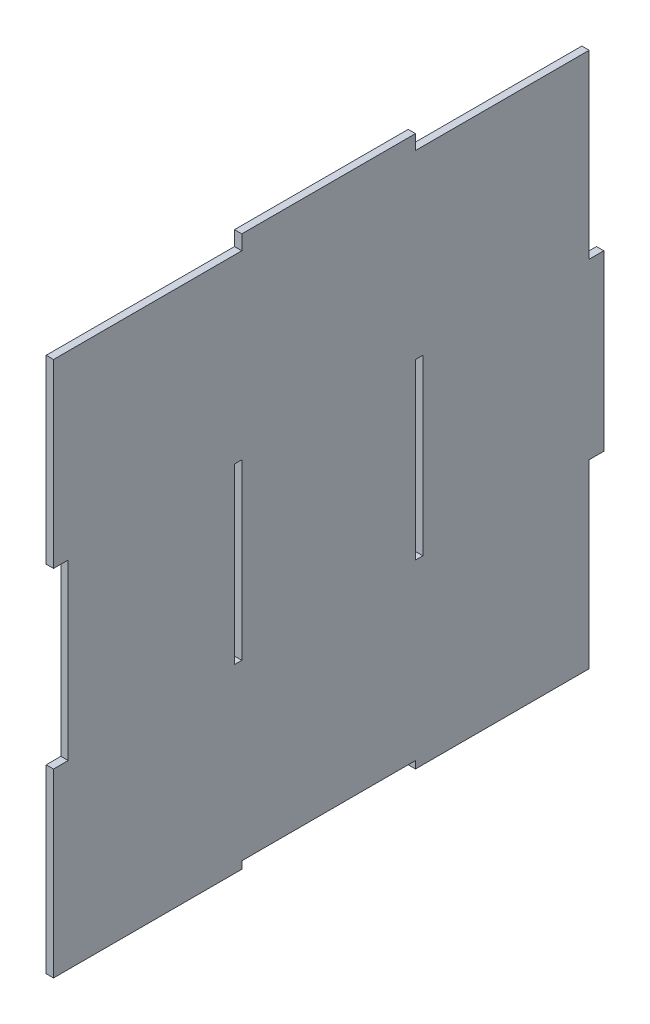
ISO-10303-21;
HEADER;
FILE_DESCRIPTION(('STEP AP214'),'2;1');
FILE_NAME('part.step','',(''),(''),'','','');
FILE_SCHEMA(('AUTOMOTIVE_DESIGN { 1 0 10303 214 1 1 1 1 }'));
ENDSEC;
DATA;
#1=APPLICATION_CONTEXT('core data for automotive mechanical design processes');
#2=APPLICATION_PROTOCOL_DEFINITION('international standard','automotive_design',2000,#1);
#3=PRODUCT_CONTEXT('',#1,'mechanical');
#4=PRODUCT('Part','Part','',(#3));
#5=PRODUCT_RELATED_PRODUCT_CATEGORY('part','',(#4));
#6=PRODUCT_DEFINITION_FORMATION('','',#4);
#7=PRODUCT_DEFINITION_CONTEXT('part definition',#1,'design');
#8=PRODUCT_DEFINITION('design','',#6,#7);
#9=PRODUCT_DEFINITION_SHAPE('','',#8);
#10=(LENGTH_UNIT() NAMED_UNIT(*) SI_UNIT(.MILLI.,.METRE.));
#11=(NAMED_UNIT(*) PLANE_ANGLE_UNIT() SI_UNIT($,.RADIAN.));
#12=(NAMED_UNIT(*) SI_UNIT($,.STERADIAN.) SOLID_ANGLE_UNIT());
#13=UNCERTAINTY_MEASURE_WITH_UNIT(LENGTH_MEASURE(1.E-05),#10,'distance_accuracy_value','');
#14=(GEOMETRIC_REPRESENTATION_CONTEXT(3) GLOBAL_UNCERTAINTY_ASSIGNED_CONTEXT((#13)) GLOBAL_UNIT_ASSIGNED_CONTEXT((#10,
#11,#12)) REPRESENTATION_CONTEXT('',''));
#15=CARTESIAN_POINT('',(0.,0.,0.));
#16=DIRECTION('',(0.,0.,1.));
#17=DIRECTION('',(1.,0.,0.));
#18=AXIS2_PLACEMENT_3D('',#15,#16,#17);
#19=CARTESIAN_POINT('',(0.,0.,0.));
#20=DIRECTION('',(1.,0.,0.));
#21=DIRECTION('',(0.,0.,-1.));
#22=AXIS2_PLACEMENT_3D('',#19,#20,#21);
#23=PLANE('',#22);
#24=DIRECTION('',(0.,0.,-1.));
#25=VECTOR('',#24,1.);
#26=CARTESIAN_POINT('',(0.,-37.666666666667,3.29278744836336E-13));
#27=LINE('',#26,#25);
#28=CARTESIAN_POINT('',(0.,-37.6666666666667,40.8416666666667));
#29=VERTEX_POINT('',#28);
#30=CARTESIAN_POINT('',(0.,-37.6666666666667,37.6666666666667));
#31=VERTEX_POINT('',#30);
#32=EDGE_CURVE('E443',#29,#31,#27,.T.);
#33=ORIENTED_EDGE('',*,*,#32,.T.);
#34=DIRECTION('',(0.,-1.,0.));
#35=VECTOR('',#34,1.);
#36=CARTESIAN_POINT('',(0.,0.,37.6666666666667));
#37=LINE('',#36,#35);
#38=CARTESIAN_POINT('',(0.,37.6666666666667,37.6666666666667));
#39=VERTEX_POINT('',#38);
#40=EDGE_CURVE('E346',#39,#31,#37,.T.);
#41=ORIENTED_EDGE('',*,*,#40,.F.);
#42=DIRECTION('',(0.,0.,-1.));
#43=VECTOR('',#42,1.);
#44=CARTESIAN_POINT('',(0.,37.666666666667,3.29278744836336E-13));
#45=LINE('',#44,#43);
#46=CARTESIAN_POINT('',(0.,37.6666666666667,40.8416666666667));
#47=VERTEX_POINT('',#46);
#48=EDGE_CURVE('E447',#47,#39,#45,.T.);
#49=ORIENTED_EDGE('',*,*,#48,.F.);
#50=DIRECTION('',(0.,1.,0.));
#51=VECTOR('',#50,1.);
#52=CARTESIAN_POINT('',(0.,0.,40.8416666666667));
#53=LINE('',#52,#51);
#54=EDGE_CURVE('E280',#29,#47,#53,.T.);
#55=ORIENTED_EDGE('',*,*,#54,.F.);
#56=EDGE_LOOP('',(#33,#41,#49,#55));
#57=FACE_BOUND('',#56,.T.);
#58=DIRECTION('',(0.,1.,0.));
#59=VECTOR('',#58,1.);
#60=CARTESIAN_POINT('',(0.,0.,-40.8416666666667));
#61=LINE('',#60,#59);
#62=CARTESIAN_POINT('',(0.,-37.6666666666667,-40.8416666666667));
#63=VERTEX_POINT('',#62);
#64=CARTESIAN_POINT('',(0.,37.6666666666667,-40.8416666666667));
#65=VERTEX_POINT('',#64);
#66=EDGE_CURVE('E431',#63,#65,#61,.T.);
#67=ORIENTED_EDGE('',*,*,#66,.T.);
#68=DIRECTION('',(0.,0.,1.));
#69=VECTOR('',#68,1.);
#70=CARTESIAN_POINT('',(0.,37.666666666667,-3.29278744836336E-13));
#71=LINE('',#70,#69);
#72=CARTESIAN_POINT('',(0.,37.6666666666667,-37.6666666666667));
#73=VERTEX_POINT('',#72);
#74=EDGE_CURVE('E440',#65,#73,#71,.T.);
#75=ORIENTED_EDGE('',*,*,#74,.T.);
#76=DIRECTION('',(0.,-1.,0.));
#77=VECTOR('',#76,1.);
#78=CARTESIAN_POINT('',(0.,0.,-37.6666666666667));
#79=LINE('',#78,#77);
#80=CARTESIAN_POINT('',(0.,-37.6666666666667,-37.6666666666667));
#81=VERTEX_POINT('',#80);
#82=EDGE_CURVE('E437',#73,#81,#79,.T.);
#83=ORIENTED_EDGE('',*,*,#82,.T.);
#84=DIRECTION('',(0.,0.,1.));
#85=VECTOR('',#84,1.);
#86=CARTESIAN_POINT('',(0.,-37.666666666667,-3.29278744836336E-13));
#87=LINE('',#86,#85);
#88=EDGE_CURVE('E434',#63,#81,#87,.T.);
#89=ORIENTED_EDGE('',*,*,#88,.F.);
#90=EDGE_LOOP('',(#67,#75,#83,#89));
#91=FACE_BOUND('',#90,.T.);
#92=DIRECTION('',(0.,0.,-1.));
#93=VECTOR('',#92,1.);
#94=CARTESIAN_POINT('',(0.,-37.6666666666662,1.64639372418165E-13));
#95=LINE('',#94,#93);
#96=CARTESIAN_POINT('',(0.,-37.6666666666667,-113.));
#97=VERTEX_POINT('',#96);
#98=CARTESIAN_POINT('',(0.,-37.6666666666667,-119.35));
#99=VERTEX_POINT('',#98);
#100=EDGE_CURVE('E315',#97,#99,#95,.T.);
#101=ORIENTED_EDGE('',*,*,#100,.F.);
#102=DIRECTION('',(0.,-1.,0.));
#103=VECTOR('',#102,1.);
#104=CARTESIAN_POINT('',(0.,0.,-113.));
#105=LINE('',#104,#103);
#106=CARTESIAN_POINT('',(0.,-116.175,-113.));
#107=VERTEX_POINT('',#106);
#108=EDGE_CURVE('E641',#97,#107,#105,.T.);
#109=ORIENTED_EDGE('',*,*,#108,.T.);
#110=DIRECTION('',(0.,0.,-1.));
#111=VECTOR('',#110,1.);
#112=CARTESIAN_POINT('',(0.,-116.175,0.));
#113=LINE('',#112,#111);
#114=CARTESIAN_POINT('',(0.,-116.175,-37.6666666666667));
#115=VERTEX_POINT('',#114);
#116=EDGE_CURVE('E428',#115,#107,#113,.T.);
#117=ORIENTED_EDGE('',*,*,#116,.F.);
#118=DIRECTION('',(0.,1.,0.));
#119=VECTOR('',#118,1.);
#120=CARTESIAN_POINT('',(0.,0.,-37.6666666666666));
#121=LINE('',#120,#119);
#122=CARTESIAN_POINT('',(0.,-113.,-37.6666666666667));
#123=VERTEX_POINT('',#122);
#124=EDGE_CURVE('E425',#115,#123,#121,.T.);
#125=ORIENTED_EDGE('',*,*,#124,.T.);
#126=DIRECTION('',(0.,0.,-1.));
#127=VECTOR('',#126,1.);
#128=CARTESIAN_POINT('',(0.,-113.,0.));
#129=LINE('',#128,#127);
#130=CARTESIAN_POINT('',(0.,-113.,37.6666666666667));
#131=VERTEX_POINT('',#130);
#132=EDGE_CURVE('E422',#131,#123,#129,.T.);
#133=ORIENTED_EDGE('',*,*,#132,.F.);
#134=DIRECTION('',(0.,1.,0.));
#135=VECTOR('',#134,1.);
#136=CARTESIAN_POINT('',(0.,0.,37.6666666666665));
#137=LINE('',#136,#135);
#138=CARTESIAN_POINT('',(0.,-116.175,37.6666666666667));
#139=VERTEX_POINT('',#138);
#140=EDGE_CURVE('E420',#139,#131,#137,.T.);
#141=ORIENTED_EDGE('',*,*,#140,.F.);
#142=DIRECTION('',(0.,0.,1.));
#143=VECTOR('',#142,1.);
#144=CARTESIAN_POINT('',(0.,-116.175,0.));
#145=LINE('',#144,#143);
#146=CARTESIAN_POINT('',(0.,-116.175,119.35));
#147=VERTEX_POINT('',#146);
#148=EDGE_CURVE('E417',#139,#147,#145,.T.);
#149=ORIENTED_EDGE('',*,*,#148,.T.);
#150=DIRECTION('',(0.,-1.,0.));
#151=VECTOR('',#150,1.);
#152=CARTESIAN_POINT('',(0.,0.,119.35));
#153=LINE('',#152,#151);
#154=CARTESIAN_POINT('',(0.,-37.6666666666667,119.35));
#155=VERTEX_POINT('',#154);
#156=EDGE_CURVE('E592',#155,#147,#153,.T.);
#157=ORIENTED_EDGE('',*,*,#156,.F.);
#158=DIRECTION('',(0.,0.,-1.));
#159=VECTOR('',#158,1.);
#160=CARTESIAN_POINT('',(0.,-37.6666666666667,0.));
#161=LINE('',#160,#159);
#162=CARTESIAN_POINT('',(0.,-37.6666666666667,113.));
#163=VERTEX_POINT('',#162);
#164=EDGE_CURVE('E414',#155,#163,#161,.T.);
#165=ORIENTED_EDGE('',*,*,#164,.T.);
#166=DIRECTION('',(0.,-1.,0.));
#167=VECTOR('',#166,1.);
#168=CARTESIAN_POINT('',(0.,0.,113.));
#169=LINE('',#168,#167);
#170=CARTESIAN_POINT('',(0.,37.6666666666667,113.));
#171=VERTEX_POINT('',#170);
#172=EDGE_CURVE('E411',#171,#163,#169,.T.);
#173=ORIENTED_EDGE('',*,*,#172,.F.);
#174=DIRECTION('',(0.,0.,1.));
#175=VECTOR('',#174,1.);
#176=CARTESIAN_POINT('',(0.,37.6666666666662,-1.64639372418165E-13));
#177=LINE('',#176,#175);
#178=CARTESIAN_POINT('',(0.,37.6666666666667,119.35));
#179=VERTEX_POINT('',#178);
#180=EDGE_CURVE('E408',#171,#179,#177,.T.);
#181=ORIENTED_EDGE('',*,*,#180,.T.);
#182=DIRECTION('',(0.,-1.,0.));
#183=VECTOR('',#182,1.);
#184=CARTESIAN_POINT('',(0.,0.,119.35));
#185=LINE('',#184,#183);
#186=CARTESIAN_POINT('',(0.,116.175,119.35));
#187=VERTEX_POINT('',#186);
#188=EDGE_CURVE('E338',#187,#179,#185,.T.);
#189=ORIENTED_EDGE('',*,*,#188,.F.);
#190=DIRECTION('',(0.,0.,1.));
#191=VECTOR('',#190,1.);
#192=CARTESIAN_POINT('',(0.,116.175,0.));
#193=LINE('',#192,#191);
#194=CARTESIAN_POINT('',(0.,116.175,37.6666666666667));
#195=VERTEX_POINT('',#194);
#196=EDGE_CURVE('E405',#195,#187,#193,.T.);
#197=ORIENTED_EDGE('',*,*,#196,.F.);
#198=DIRECTION('',(0.,-1.,0.));
#199=VECTOR('',#198,1.);
#200=CARTESIAN_POINT('',(0.,119.35,37.6666666666667));
#201=LINE('',#200,#199);
#202=CARTESIAN_POINT('',(0.,122.525,37.6666666666667));
#203=VERTEX_POINT('',#202);
#204=EDGE_CURVE('E119',#203,#195,#201,.T.);
#205=ORIENTED_EDGE('',*,*,#204,.F.);
#206=DIRECTION('',(0.,0.,1.));
#207=VECTOR('',#206,1.);
#208=CARTESIAN_POINT('',(0.,122.525,0.));
#209=LINE('',#208,#207);
#210=CARTESIAN_POINT('',(0.,122.525,-37.6666666666667));
#211=VERTEX_POINT('',#210);
#212=EDGE_CURVE('E581',#211,#203,#209,.T.);
#213=ORIENTED_EDGE('',*,*,#212,.F.);
#214=DIRECTION('',(0.,-1.,0.));
#215=VECTOR('',#214,1.);
#216=CARTESIAN_POINT('',(0.,0.,-37.6666666666665));
#217=LINE('',#216,#215);
#218=CARTESIAN_POINT('',(0.,116.175,-37.6666666666667));
#219=VERTEX_POINT('',#218);
#220=EDGE_CURVE('E402',#211,#219,#217,.T.);
#221=ORIENTED_EDGE('',*,*,#220,.T.);
#222=DIRECTION('',(0.,0.,-1.));
#223=VECTOR('',#222,1.);
#224=CARTESIAN_POINT('',(0.,116.175,0.));
#225=LINE('',#224,#223);
#226=CARTESIAN_POINT('',(0.,116.175,-113.));
#227=VERTEX_POINT('',#226);
#228=EDGE_CURVE('E399',#219,#227,#225,.T.);
#229=ORIENTED_EDGE('',*,*,#228,.T.);
#230=DIRECTION('',(0.,1.,0.));
#231=VECTOR('',#230,1.);
#232=CARTESIAN_POINT('',(0.,0.,-113.));
#233=LINE('',#232,#231);
#234=CARTESIAN_POINT('',(0.,37.6666666666667,-113.));
#235=VERTEX_POINT('',#234);
#236=EDGE_CURVE('E132',#235,#227,#233,.T.);
#237=ORIENTED_EDGE('',*,*,#236,.F.);
#238=DIRECTION('',(0.,0.,-1.));
#239=VECTOR('',#238,1.);
#240=CARTESIAN_POINT('',(0.,37.6666666666662,1.64639372418165E-13));
#241=LINE('',#240,#239);
#242=CARTESIAN_POINT('',(0.,37.6666666666667,-119.35));
#243=VERTEX_POINT('',#242);
#244=EDGE_CURVE('E396',#235,#243,#241,.T.);
#245=ORIENTED_EDGE('',*,*,#244,.T.);
#246=DIRECTION('',(0.,-1.,0.));
#247=VECTOR('',#246,1.);
#248=CARTESIAN_POINT('',(0.,0.,-119.35));
#249=LINE('',#248,#247);
#250=EDGE_CURVE('E321',#243,#99,#249,.T.);
#251=ORIENTED_EDGE('',*,*,#250,.T.);
#252=EDGE_LOOP('',(#101,#109,#117,#125,#133,#141,#149,#157,#165,#173,#181,#189,#197,#205,#213,
#221,#229,#237,#245,#251));
#253=FACE_BOUND('',#252,.T.);
#254=ADVANCED_FACE('F115',(#57,#91,#253),#23,.F.);
#255=CARTESIAN_POINT('',(3.175,0.,0.));
#256=DIRECTION('',(1.,0.,0.));
#257=DIRECTION('',(0.,0.,-1.));
#258=AXIS2_PLACEMENT_3D('',#255,#256,#257);
#259=PLANE('',#258);
#260=DIRECTION('',(0.,0.,-1.));
#261=VECTOR('',#260,1.);
#262=CARTESIAN_POINT('',(3.175,-37.666666666667,3.29278744836336E-13));
#263=LINE('',#262,#261);
#264=CARTESIAN_POINT('',(3.175,-37.6666666666667,40.8416666666667));
#265=VERTEX_POINT('',#264);
#266=CARTESIAN_POINT('',(3.175,-37.6666666666667,37.6666666666667));
#267=VERTEX_POINT('',#266);
#268=EDGE_CURVE('E275',#265,#267,#263,.T.);
#269=ORIENTED_EDGE('',*,*,#268,.F.);
#270=DIRECTION('',(0.,1.,0.));
#271=VECTOR('',#270,1.);
#272=CARTESIAN_POINT('',(3.175,0.,40.8416666666667));
#273=LINE('',#272,#271);
#274=CARTESIAN_POINT('',(3.175,37.6666666666667,40.8416666666667));
#275=VERTEX_POINT('',#274);
#276=EDGE_CURVE('E270',#265,#275,#273,.T.);
#277=ORIENTED_EDGE('',*,*,#276,.T.);
#278=DIRECTION('',(0.,0.,-1.));
#279=VECTOR('',#278,1.);
#280=CARTESIAN_POINT('',(3.175,37.666666666667,3.29278744836336E-13));
#281=LINE('',#280,#279);
#282=CARTESIAN_POINT('',(3.175,37.6666666666667,37.6666666666667));
#283=VERTEX_POINT('',#282);
#284=EDGE_CURVE('E262',#275,#283,#281,.T.);
#285=ORIENTED_EDGE('',*,*,#284,.T.);
#286=DIRECTION('',(0.,-1.,0.));
#287=VECTOR('',#286,1.);
#288=CARTESIAN_POINT('',(3.175,0.,37.6666666666667));
#289=LINE('',#288,#287);
#290=EDGE_CURVE('E141',#283,#267,#289,.T.);
#291=ORIENTED_EDGE('',*,*,#290,.T.);
#292=EDGE_LOOP('',(#269,#277,#285,#291));
#293=FACE_BOUND('',#292,.T.);
#294=DIRECTION('',(0.,1.,0.));
#295=VECTOR('',#294,1.);
#296=CARTESIAN_POINT('',(3.175,0.,-40.8416666666667));
#297=LINE('',#296,#295);
#298=CARTESIAN_POINT('',(3.175,-37.6666666666667,-40.8416666666667));
#299=VERTEX_POINT('',#298);
#300=CARTESIAN_POINT('',(3.175,37.6666666666667,-40.8416666666667));
#301=VERTEX_POINT('',#300);
#302=EDGE_CURVE('E381',#299,#301,#297,.T.);
#303=ORIENTED_EDGE('',*,*,#302,.F.);
#304=DIRECTION('',(0.,0.,1.));
#305=VECTOR('',#304,1.);
#306=CARTESIAN_POINT('',(3.175,-37.666666666667,-3.29278744836336E-13));
#307=LINE('',#306,#305);
#308=CARTESIAN_POINT('',(3.175,-37.6666666666667,-37.6666666666667));
#309=VERTEX_POINT('',#308);
#310=EDGE_CURVE('E384',#299,#309,#307,.T.);
#311=ORIENTED_EDGE('',*,*,#310,.T.);
#312=DIRECTION('',(0.,-1.,0.));
#313=VECTOR('',#312,1.);
#314=CARTESIAN_POINT('',(3.175,0.,-37.6666666666667));
#315=LINE('',#314,#313);
#316=CARTESIAN_POINT('',(3.175,37.6666666666667,-37.6666666666667));
#317=VERTEX_POINT('',#316);
#318=EDGE_CURVE('E386',#317,#309,#315,.T.);
#319=ORIENTED_EDGE('',*,*,#318,.F.);
#320=DIRECTION('',(0.,0.,1.));
#321=VECTOR('',#320,1.);
#322=CARTESIAN_POINT('',(3.175,37.666666666667,-3.29278744836336E-13));
#323=LINE('',#322,#321);
#324=EDGE_CURVE('E389',#301,#317,#323,.T.);
#325=ORIENTED_EDGE('',*,*,#324,.F.);
#326=EDGE_LOOP('',(#303,#311,#319,#325));
#327=FACE_BOUND('',#326,.T.);
#328=DIRECTION('',(0.,-1.,0.));
#329=VECTOR('',#328,1.);
#330=CARTESIAN_POINT('',(3.17500000000001,0.,-113.));
#331=LINE('',#330,#329);
#332=CARTESIAN_POINT('',(3.17500000000001,-37.6666666666667,-113.));
#333=VERTEX_POINT('',#332);
#334=CARTESIAN_POINT('',(3.17500000000001,-116.175,-113.));
#335=VERTEX_POINT('',#334);
#336=EDGE_CURVE('E642',#333,#335,#331,.T.);
#337=ORIENTED_EDGE('',*,*,#336,.F.);
#338=DIRECTION('',(0.,0.,-1.));
#339=VECTOR('',#338,1.);
#340=CARTESIAN_POINT('',(3.175,-37.6666666666662,1.64639372418165E-13));
#341=LINE('',#340,#339);
#342=CARTESIAN_POINT('',(3.175,-37.6666666666667,-119.35));
#343=VERTEX_POINT('',#342);
#344=EDGE_CURVE('E212',#333,#343,#341,.T.);
#345=ORIENTED_EDGE('',*,*,#344,.T.);
#346=DIRECTION('',(0.,-1.,0.));
#347=VECTOR('',#346,1.);
#348=CARTESIAN_POINT('',(3.175,0.,-119.35));
#349=LINE('',#348,#347);
#350=CARTESIAN_POINT('',(3.175,37.6666666666667,-119.35));
#351=VERTEX_POINT('',#350);
#352=EDGE_CURVE('E345',#351,#343,#349,.T.);
#353=ORIENTED_EDGE('',*,*,#352,.F.);
#354=DIRECTION('',(0.,0.,-1.));
#355=VECTOR('',#354,1.);
#356=CARTESIAN_POINT('',(3.175,37.6666666666662,1.64639372418165E-13));
#357=LINE('',#356,#355);
#358=CARTESIAN_POINT('',(3.17500000000001,37.6666666666667,-113.));
#359=VERTEX_POINT('',#358);
#360=EDGE_CURVE('E349',#359,#351,#357,.T.);
#361=ORIENTED_EDGE('',*,*,#360,.F.);
#362=DIRECTION('',(0.,1.,0.));
#363=VECTOR('',#362,1.);
#364=CARTESIAN_POINT('',(3.17500000000001,0.,-113.));
#365=LINE('',#364,#363);
#366=CARTESIAN_POINT('',(3.17500000000001,116.175,-113.));
#367=VERTEX_POINT('',#366);
#368=EDGE_CURVE('E569',#359,#367,#365,.T.);
#369=ORIENTED_EDGE('',*,*,#368,.T.);
#370=DIRECTION('',(0.,0.,-1.));
#371=VECTOR('',#370,1.);
#372=CARTESIAN_POINT('',(3.175,116.175,0.));
#373=LINE('',#372,#371);
#374=CARTESIAN_POINT('',(3.175,116.175,-37.6666666666667));
#375=VERTEX_POINT('',#374);
#376=EDGE_CURVE('E352',#375,#367,#373,.T.);
#377=ORIENTED_EDGE('',*,*,#376,.F.);
#378=DIRECTION('',(0.,-1.,0.));
#379=VECTOR('',#378,1.);
#380=CARTESIAN_POINT('',(3.175,0.,-37.6666666666665));
#381=LINE('',#380,#379);
#382=CARTESIAN_POINT('',(3.175,122.525,-37.6666666666667));
#383=VERTEX_POINT('',#382);
#384=EDGE_CURVE('E355',#383,#375,#381,.T.);
#385=ORIENTED_EDGE('',*,*,#384,.F.);
#386=DIRECTION('',(0.,0.,1.));
#387=VECTOR('',#386,1.);
#388=CARTESIAN_POINT('',(3.175,122.525,0.));
#389=LINE('',#388,#387);
#390=CARTESIAN_POINT('',(3.175,122.525,37.6666666666667));
#391=VERTEX_POINT('',#390);
#392=EDGE_CURVE('E579',#383,#391,#389,.T.);
#393=ORIENTED_EDGE('',*,*,#392,.T.);
#394=DIRECTION('',(0.,-1.,0.));
#395=VECTOR('',#394,1.);
#396=CARTESIAN_POINT('',(3.175,119.35,37.6666666666667));
#397=LINE('',#396,#395);
#398=CARTESIAN_POINT('',(3.175,116.175,37.6666666666667));
#399=VERTEX_POINT('',#398);
#400=EDGE_CURVE('E313',#391,#399,#397,.T.);
#401=ORIENTED_EDGE('',*,*,#400,.T.);
#402=DIRECTION('',(0.,0.,1.));
#403=VECTOR('',#402,1.);
#404=CARTESIAN_POINT('',(3.175,116.175,0.));
#405=LINE('',#404,#403);
#406=CARTESIAN_POINT('',(3.17499999999999,116.175,119.35));
#407=VERTEX_POINT('',#406);
#408=EDGE_CURVE('E358',#399,#407,#405,.T.);
#409=ORIENTED_EDGE('',*,*,#408,.T.);
#410=DIRECTION('',(0.,-1.,0.));
#411=VECTOR('',#410,1.);
#412=CARTESIAN_POINT('',(3.17499999999999,0.,119.35));
#413=LINE('',#412,#411);
#414=CARTESIAN_POINT('',(3.17499999999999,37.6666666666667,119.35));
#415=VERTEX_POINT('',#414);
#416=EDGE_CURVE('E341',#407,#415,#413,.T.);
#417=ORIENTED_EDGE('',*,*,#416,.T.);
#418=DIRECTION('',(0.,0.,1.));
#419=VECTOR('',#418,1.);
#420=CARTESIAN_POINT('',(3.175,37.6666666666662,-1.64639372418165E-13));
#421=LINE('',#420,#419);
#422=CARTESIAN_POINT('',(3.175,37.6666666666667,113.));
#423=VERTEX_POINT('',#422);
#424=EDGE_CURVE('E360',#423,#415,#421,.T.);
#425=ORIENTED_EDGE('',*,*,#424,.F.);
#426=DIRECTION('',(0.,-1.,0.));
#427=VECTOR('',#426,1.);
#428=CARTESIAN_POINT('',(3.175,0.,113.));
#429=LINE('',#428,#427);
#430=CARTESIAN_POINT('',(3.175,-37.6666666666667,113.));
#431=VERTEX_POINT('',#430);
#432=EDGE_CURVE('E363',#423,#431,#429,.T.);
#433=ORIENTED_EDGE('',*,*,#432,.T.);
#434=DIRECTION('',(0.,0.,-1.));
#435=VECTOR('',#434,1.);
#436=CARTESIAN_POINT('',(3.175,-37.6666666666667,0.));
#437=LINE('',#436,#435);
#438=CARTESIAN_POINT('',(3.17499999999999,-37.6666666666667,119.35));
#439=VERTEX_POINT('',#438);
#440=EDGE_CURVE('E365',#439,#431,#437,.T.);
#441=ORIENTED_EDGE('',*,*,#440,.F.);
#442=DIRECTION('',(0.,-1.,0.));
#443=VECTOR('',#442,1.);
#444=CARTESIAN_POINT('',(3.17499999999999,0.,119.35));
#445=LINE('',#444,#443);
#446=CARTESIAN_POINT('',(3.17499999999999,-116.175,119.35));
#447=VERTEX_POINT('',#446);
#448=EDGE_CURVE('E589',#439,#447,#445,.T.);
#449=ORIENTED_EDGE('',*,*,#448,.T.);
#450=DIRECTION('',(0.,0.,1.));
#451=VECTOR('',#450,1.);
#452=CARTESIAN_POINT('',(3.175,-116.175,0.));
#453=LINE('',#452,#451);
#454=CARTESIAN_POINT('',(3.175,-116.175,37.6666666666667));
#455=VERTEX_POINT('',#454);
#456=EDGE_CURVE('E368',#455,#447,#453,.T.);
#457=ORIENTED_EDGE('',*,*,#456,.F.);
#458=DIRECTION('',(0.,1.,0.));
#459=VECTOR('',#458,1.);
#460=CARTESIAN_POINT('',(3.175,0.,37.6666666666665));
#461=LINE('',#460,#459);
#462=CARTESIAN_POINT('',(3.175,-113.,37.6666666666667));
#463=VERTEX_POINT('',#462);
#464=EDGE_CURVE('E371',#455,#463,#461,.T.);
#465=ORIENTED_EDGE('',*,*,#464,.T.);
#466=DIRECTION('',(0.,0.,-1.));
#467=VECTOR('',#466,1.);
#468=CARTESIAN_POINT('',(3.175,-113.,0.));
#469=LINE('',#468,#467);
#470=CARTESIAN_POINT('',(3.175,-113.,-37.6666666666667));
#471=VERTEX_POINT('',#470);
#472=EDGE_CURVE('E373',#463,#471,#469,.T.);
#473=ORIENTED_EDGE('',*,*,#472,.T.);
#474=DIRECTION('',(0.,1.,0.));
#475=VECTOR('',#474,1.);
#476=CARTESIAN_POINT('',(3.175,0.,-37.6666666666666));
#477=LINE('',#476,#475);
#478=CARTESIAN_POINT('',(3.175,-116.175,-37.6666666666667));
#479=VERTEX_POINT('',#478);
#480=EDGE_CURVE('E375',#479,#471,#477,.T.);
#481=ORIENTED_EDGE('',*,*,#480,.F.);
#482=DIRECTION('',(0.,0.,-1.));
#483=VECTOR('',#482,1.);
#484=CARTESIAN_POINT('',(3.175,-116.175,0.));
#485=LINE('',#484,#483);
#486=EDGE_CURVE('E378',#479,#335,#485,.T.);
#487=ORIENTED_EDGE('',*,*,#486,.T.);
#488=EDGE_LOOP('',(#337,#345,#353,#361,#369,#377,#385,#393,#401,#409,#417,#425,#433,#441,#449,
#457,#465,#473,#481,#487));
#489=FACE_BOUND('',#488,.T.);
#490=ADVANCED_FACE('F273',(#293,#327,#489),#259,.T.);
#491=CARTESIAN_POINT('',(3.175,116.175,0.));
#492=DIRECTION('',(0.,1.,0.));
#493=DIRECTION('',(0.,0.,1.));
#494=AXIS2_PLACEMENT_3D('',#491,#492,#493);
#495=PLANE('',#494);
#496=ORIENTED_EDGE('',*,*,#376,.T.);
#497=DIRECTION('',(1.,0.,0.));
#498=VECTOR('',#497,1.);
#499=CARTESIAN_POINT('',(0.,116.175,-113.));
#500=LINE('',#499,#498);
#501=EDGE_CURVE('E567',#227,#367,#500,.T.);
#502=ORIENTED_EDGE('',*,*,#501,.F.);
#503=ORIENTED_EDGE('',*,*,#228,.F.);
#504=DIRECTION('',(-1.,0.,0.));
#505=VECTOR('',#504,1.);
#506=CARTESIAN_POINT('',(3.175,116.175,-37.6666666666667));
#507=LINE('',#506,#505);
#508=EDGE_CURVE('E309',#375,#219,#507,.T.);
#509=ORIENTED_EDGE('',*,*,#508,.F.);
#510=EDGE_LOOP('',(#496,#502,#503,#509));
#511=FACE_BOUND('',#510,.T.);
#512=ADVANCED_FACE('F469',(#511),#495,.T.);
#513=CARTESIAN_POINT('',(3.175,0.,-37.6666666666665));
#514=DIRECTION('',(0.,0.,-1.));
#515=DIRECTION('',(0.,1.,0.));
#516=AXIS2_PLACEMENT_3D('',#513,#514,#515);
#517=PLANE('',#516);
#518=ORIENTED_EDGE('',*,*,#220,.F.);
#519=DIRECTION('',(1.,0.,0.));
#520=VECTOR('',#519,1.);
#521=CARTESIAN_POINT('',(0.,122.525,-37.6666666666667));
#522=LINE('',#521,#520);
#523=EDGE_CURVE('E584',#211,#383,#522,.T.);
#524=ORIENTED_EDGE('',*,*,#523,.T.);
#525=ORIENTED_EDGE('',*,*,#384,.T.);
#526=ORIENTED_EDGE('',*,*,#508,.T.);
#527=EDGE_LOOP('',(#518,#524,#525,#526));
#528=FACE_BOUND('',#527,.T.);
#529=ADVANCED_FACE('F528',(#528),#517,.T.);
#530=CARTESIAN_POINT('',(3.175,116.175,0.));
#531=DIRECTION('',(0.,-1.,0.));
#532=DIRECTION('',(0.,0.,-1.));
#533=AXIS2_PLACEMENT_3D('',#530,#531,#532);
#534=PLANE('',#533);
#535=ORIENTED_EDGE('',*,*,#196,.T.);
#536=DIRECTION('',(1.,0.,0.));
#537=VECTOR('',#536,1.);
#538=CARTESIAN_POINT('',(0.,116.175,119.35));
#539=LINE('',#538,#537);
#540=EDGE_CURVE('E330',#187,#407,#539,.T.);
#541=ORIENTED_EDGE('',*,*,#540,.T.);
#542=ORIENTED_EDGE('',*,*,#408,.F.);
#543=DIRECTION('',(-1.,0.,0.));
#544=VECTOR('',#543,1.);
#545=CARTESIAN_POINT('',(3.175,116.175,37.6666666666667));
#546=LINE('',#545,#544);
#547=EDGE_CURVE('E307',#399,#195,#546,.T.);
#548=ORIENTED_EDGE('',*,*,#547,.T.);
#549=EDGE_LOOP('',(#535,#541,#542,#548));
#550=FACE_BOUND('',#549,.T.);
#551=ADVANCED_FACE('F524',(#550),#534,.F.);
#552=CARTESIAN_POINT('',(3.175,37.6666666666662,-1.64639372418165E-13));
#553=DIRECTION('',(0.,-1.,0.));
#554=DIRECTION('',(0.,0.,-1.));
#555=AXIS2_PLACEMENT_3D('',#552,#553,#554);
#556=PLANE('',#555);
#557=ORIENTED_EDGE('',*,*,#180,.F.);
#558=DIRECTION('',(-1.,0.,0.));
#559=VECTOR('',#558,1.);
#560=CARTESIAN_POINT('',(3.175,37.6666666666667,113.));
#561=LINE('',#560,#559);
#562=EDGE_CURVE('E305',#423,#171,#561,.T.);
#563=ORIENTED_EDGE('',*,*,#562,.F.);
#564=ORIENTED_EDGE('',*,*,#424,.T.);
#565=DIRECTION('',(1.,0.,0.));
#566=VECTOR('',#565,1.);
#567=CARTESIAN_POINT('',(0.,37.6666666666667,119.35));
#568=LINE('',#567,#566);
#569=EDGE_CURVE('E324',#179,#415,#568,.T.);
#570=ORIENTED_EDGE('',*,*,#569,.F.);
#571=EDGE_LOOP('',(#557,#563,#564,#570));
#572=FACE_BOUND('',#571,.T.);
#573=ADVANCED_FACE('F520',(#572),#556,.T.);
#574=CARTESIAN_POINT('',(3.175,0.,113.));
#575=DIRECTION('',(0.,0.,-1.));
#576=DIRECTION('',(0.,1.,0.));
#577=AXIS2_PLACEMENT_3D('',#574,#575,#576);
#578=PLANE('',#577);
#579=ORIENTED_EDGE('',*,*,#172,.T.);
#580=DIRECTION('',(-1.,0.,0.));
#581=VECTOR('',#580,1.);
#582=CARTESIAN_POINT('',(3.175,-37.6666666666667,113.));
#583=LINE('',#582,#581);
#584=EDGE_CURVE('E303',#431,#163,#583,.T.);
#585=ORIENTED_EDGE('',*,*,#584,.F.);
#586=ORIENTED_EDGE('',*,*,#432,.F.);
#587=ORIENTED_EDGE('',*,*,#562,.T.);
#588=EDGE_LOOP('',(#579,#585,#586,#587));
#589=FACE_BOUND('',#588,.T.);
#590=ADVANCED_FACE('F516',(#589),#578,.F.);
#591=CARTESIAN_POINT('',(3.175,-37.6666666666667,0.));
#592=DIRECTION('',(0.,1.,0.));
#593=DIRECTION('',(0.,0.,1.));
#594=AXIS2_PLACEMENT_3D('',#591,#592,#593);
#595=PLANE('',#594);
#596=ORIENTED_EDGE('',*,*,#164,.F.);
#597=DIRECTION('',(1.,0.,0.));
#598=VECTOR('',#597,1.);
#599=CARTESIAN_POINT('',(0.,-37.6666666666667,119.35));
#600=LINE('',#599,#598);
#601=EDGE_CURVE('E595',#155,#439,#600,.T.);
#602=ORIENTED_EDGE('',*,*,#601,.T.);
#603=ORIENTED_EDGE('',*,*,#440,.T.);
#604=ORIENTED_EDGE('',*,*,#584,.T.);
#605=EDGE_LOOP('',(#596,#602,#603,#604));
#606=FACE_BOUND('',#605,.T.);
#607=ADVANCED_FACE('F512',(#606),#595,.T.);
#608=CARTESIAN_POINT('',(3.175,-116.175,0.));
#609=DIRECTION('',(0.,-1.,0.));
#610=DIRECTION('',(0.,0.,-1.));
#611=AXIS2_PLACEMENT_3D('',#608,#609,#610);
#612=PLANE('',#611);
#613=ORIENTED_EDGE('',*,*,#148,.F.);
#614=DIRECTION('',(-1.,0.,0.));
#615=VECTOR('',#614,1.);
#616=CARTESIAN_POINT('',(3.175,-116.175,37.6666666666667));
#617=LINE('',#616,#615);
#618=EDGE_CURVE('E301',#455,#139,#617,.T.);
#619=ORIENTED_EDGE('',*,*,#618,.F.);
#620=ORIENTED_EDGE('',*,*,#456,.T.);
#621=DIRECTION('',(1.,0.,0.));
#622=VECTOR('',#621,1.);
#623=CARTESIAN_POINT('',(0.,-116.175,119.35));
#624=LINE('',#623,#622);
#625=EDGE_CURVE('E598',#147,#447,#624,.T.);
#626=ORIENTED_EDGE('',*,*,#625,.F.);
#627=EDGE_LOOP('',(#613,#619,#620,#626));
#628=FACE_BOUND('',#627,.T.);
#629=ADVANCED_FACE('F508',(#628),#612,.T.);
#630=CARTESIAN_POINT('',(3.175,0.,37.6666666666665));
#631=DIRECTION('',(0.,0.,1.));
#632=DIRECTION('',(0.,-1.,0.));
#633=AXIS2_PLACEMENT_3D('',#630,#631,#632);
#634=PLANE('',#633);
#635=ORIENTED_EDGE('',*,*,#140,.T.);
#636=DIRECTION('',(-1.,0.,0.));
#637=VECTOR('',#636,1.);
#638=CARTESIAN_POINT('',(3.175,-113.,37.6666666666667));
#639=LINE('',#638,#637);
#640=EDGE_CURVE('E298',#463,#131,#639,.T.);
#641=ORIENTED_EDGE('',*,*,#640,.F.);
#642=ORIENTED_EDGE('',*,*,#464,.F.);
#643=ORIENTED_EDGE('',*,*,#618,.T.);
#644=EDGE_LOOP('',(#635,#641,#642,#643));
#645=FACE_BOUND('',#644,.T.);
#646=ADVANCED_FACE('F504',(#645),#634,.F.);
#647=CARTESIAN_POINT('',(3.175,-113.,0.));
#648=DIRECTION('',(0.,1.,0.));
#649=DIRECTION('',(0.,0.,1.));
#650=AXIS2_PLACEMENT_3D('',#647,#648,#649);
#651=PLANE('',#650);
#652=ORIENTED_EDGE('',*,*,#132,.T.);
#653=DIRECTION('',(-1.,0.,0.));
#654=VECTOR('',#653,1.);
#655=CARTESIAN_POINT('',(3.175,-113.,-37.6666666666667));
#656=LINE('',#655,#654);
#657=EDGE_CURVE('E296',#471,#123,#656,.T.);
#658=ORIENTED_EDGE('',*,*,#657,.F.);
#659=ORIENTED_EDGE('',*,*,#472,.F.);
#660=ORIENTED_EDGE('',*,*,#640,.T.);
#661=EDGE_LOOP('',(#652,#658,#659,#660));
#662=FACE_BOUND('',#661,.T.);
#663=ADVANCED_FACE('F500',(#662),#651,.F.);
#664=CARTESIAN_POINT('',(3.175,0.,-37.6666666666666));
#665=DIRECTION('',(0.,0.,1.));
#666=DIRECTION('',(0.,-1.,0.));
#667=AXIS2_PLACEMENT_3D('',#664,#665,#666);
#668=PLANE('',#667);
#669=ORIENTED_EDGE('',*,*,#124,.F.);
#670=DIRECTION('',(-1.,0.,0.));
#671=VECTOR('',#670,1.);
#672=CARTESIAN_POINT('',(3.175,-116.175,-37.6666666666667));
#673=LINE('',#672,#671);
#674=EDGE_CURVE('E294',#479,#115,#673,.T.);
#675=ORIENTED_EDGE('',*,*,#674,.F.);
#676=ORIENTED_EDGE('',*,*,#480,.T.);
#677=ORIENTED_EDGE('',*,*,#657,.T.);
#678=EDGE_LOOP('',(#669,#675,#676,#677));
#679=FACE_BOUND('',#678,.T.);
#680=ADVANCED_FACE('F496',(#679),#668,.T.);
#681=CARTESIAN_POINT('',(3.175,-116.175,0.));
#682=DIRECTION('',(0.,1.,0.));
#683=DIRECTION('',(0.,0.,1.));
#684=AXIS2_PLACEMENT_3D('',#681,#682,#683);
#685=PLANE('',#684);
#686=ORIENTED_EDGE('',*,*,#116,.T.);
#687=DIRECTION('',(1.,0.,0.));
#688=VECTOR('',#687,1.);
#689=CARTESIAN_POINT('',(0.,-116.175,-113.));
#690=LINE('',#689,#688);
#691=EDGE_CURVE('E572',#107,#335,#690,.T.);
#692=ORIENTED_EDGE('',*,*,#691,.T.);
#693=ORIENTED_EDGE('',*,*,#486,.F.);
#694=ORIENTED_EDGE('',*,*,#674,.T.);
#695=EDGE_LOOP('',(#686,#692,#693,#694));
#696=FACE_BOUND('',#695,.T.);
#697=ADVANCED_FACE('F492',(#696),#685,.F.);
#698=CARTESIAN_POINT('',(3.175,-37.6666666666662,1.64639372418165E-13));
#699=DIRECTION('',(0.,1.,0.));
#700=DIRECTION('',(0.,0.,1.));
#701=AXIS2_PLACEMENT_3D('',#698,#699,#700);
#702=PLANE('',#701);
#703=ORIENTED_EDGE('',*,*,#100,.T.);
#704=DIRECTION('',(-1.,0.,0.));
#705=VECTOR('',#704,1.);
#706=CARTESIAN_POINT('',(3.175,-37.6666666666667,-119.35));
#707=LINE('',#706,#705);
#708=EDGE_CURVE('E288',#343,#99,#707,.T.);
#709=ORIENTED_EDGE('',*,*,#708,.F.);
#710=ORIENTED_EDGE('',*,*,#344,.F.);
#711=DIRECTION('',(1.,0.,0.));
#712=VECTOR('',#711,1.);
#713=CARTESIAN_POINT('',(0.,-37.6666666666667,-113.));
#714=LINE('',#713,#712);
#715=EDGE_CURVE('E551',#97,#333,#714,.T.);
#716=ORIENTED_EDGE('',*,*,#715,.F.);
#717=EDGE_LOOP('',(#703,#709,#710,#716));
#718=FACE_BOUND('',#717,.T.);
#719=ADVANCED_FACE('F495',(#718),#702,.F.);
#720=CARTESIAN_POINT('',(3.175,0.,-119.35));
#721=DIRECTION('',(0.,0.,-1.));
#722=DIRECTION('',(0.,1.,0.));
#723=AXIS2_PLACEMENT_3D('',#720,#721,#722);
#724=PLANE('',#723);
#725=ORIENTED_EDGE('',*,*,#250,.F.);
#726=DIRECTION('',(-1.,0.,0.));
#727=VECTOR('',#726,1.);
#728=CARTESIAN_POINT('',(3.175,37.6666666666667,-119.35));
#729=LINE('',#728,#727);
#730=EDGE_CURVE('E311',#351,#243,#729,.T.);
#731=ORIENTED_EDGE('',*,*,#730,.F.);
#732=ORIENTED_EDGE('',*,*,#352,.T.);
#733=ORIENTED_EDGE('',*,*,#708,.T.);
#734=EDGE_LOOP('',(#725,#731,#732,#733));
#735=FACE_BOUND('',#734,.T.);
#736=ADVANCED_FACE('F539',(#735),#724,.T.);
#737=CARTESIAN_POINT('',(3.175,37.6666666666662,1.64639372418165E-13));
#738=DIRECTION('',(0.,1.,0.));
#739=DIRECTION('',(0.,0.,1.));
#740=AXIS2_PLACEMENT_3D('',#737,#738,#739);
#741=PLANE('',#740);
#742=ORIENTED_EDGE('',*,*,#244,.F.);
#743=DIRECTION('',(1.,0.,0.));
#744=VECTOR('',#743,1.);
#745=CARTESIAN_POINT('',(0.,37.6666666666667,-113.));
#746=LINE('',#745,#744);
#747=EDGE_CURVE('E561',#235,#359,#746,.T.);
#748=ORIENTED_EDGE('',*,*,#747,.T.);
#749=ORIENTED_EDGE('',*,*,#360,.T.);
#750=ORIENTED_EDGE('',*,*,#730,.T.);
#751=EDGE_LOOP('',(#742,#748,#749,#750));
#752=FACE_BOUND('',#751,.T.);
#753=ADVANCED_FACE('F536',(#752),#741,.T.);
#754=CARTESIAN_POINT('',(3.175,-37.666666666667,-3.29278744836336E-13));
#755=DIRECTION('',(0.,-1.,0.));
#756=DIRECTION('',(0.,0.,-1.));
#757=AXIS2_PLACEMENT_3D('',#754,#755,#756);
#758=PLANE('',#757);
#759=ORIENTED_EDGE('',*,*,#88,.T.);
#760=DIRECTION('',(-1.,0.,0.));
#761=VECTOR('',#760,1.);
#762=CARTESIAN_POINT('',(3.175,-37.6666666666667,-37.6666666666667));
#763=LINE('',#762,#761);
#764=EDGE_CURVE('E290',#309,#81,#763,.T.);
#765=ORIENTED_EDGE('',*,*,#764,.F.);
#766=ORIENTED_EDGE('',*,*,#310,.F.);
#767=DIRECTION('',(-1.,0.,0.));
#768=VECTOR('',#767,1.);
#769=CARTESIAN_POINT('',(3.175,-37.6666666666667,-40.8416666666667));
#770=LINE('',#769,#768);
#771=EDGE_CURVE('E292',#299,#63,#770,.T.);
#772=ORIENTED_EDGE('',*,*,#771,.T.);
#773=EDGE_LOOP('',(#759,#765,#766,#772));
#774=FACE_BOUND('',#773,.T.);
#775=ADVANCED_FACE('F490',(#774),#758,.F.);
#776=CARTESIAN_POINT('',(3.175,0.,-37.6666666666667));
#777=DIRECTION('',(0.,0.,-1.));
#778=DIRECTION('',(0.,1.,0.));
#779=AXIS2_PLACEMENT_3D('',#776,#777,#778);
#780=PLANE('',#779);
#781=ORIENTED_EDGE('',*,*,#82,.F.);
#782=DIRECTION('',(-1.,0.,0.));
#783=VECTOR('',#782,1.);
#784=CARTESIAN_POINT('',(3.175,37.6666666666667,-37.6666666666667));
#785=LINE('',#784,#783);
#786=EDGE_CURVE('E287',#317,#73,#785,.T.);
#787=ORIENTED_EDGE('',*,*,#786,.F.);
#788=ORIENTED_EDGE('',*,*,#318,.T.);
#789=ORIENTED_EDGE('',*,*,#764,.T.);
#790=EDGE_LOOP('',(#781,#787,#788,#789));
#791=FACE_BOUND('',#790,.T.);
#792=ADVANCED_FACE('F485',(#791),#780,.T.);
#793=CARTESIAN_POINT('',(3.175,37.666666666667,-3.29278744836336E-13));
#794=DIRECTION('',(0.,-1.,0.));
#795=DIRECTION('',(0.,0.,-1.));
#796=AXIS2_PLACEMENT_3D('',#793,#794,#795);
#797=PLANE('',#796);
#798=ORIENTED_EDGE('',*,*,#74,.F.);
#799=DIRECTION('',(-1.,0.,0.));
#800=VECTOR('',#799,1.);
#801=CARTESIAN_POINT('',(3.175,37.6666666666667,-40.8416666666667));
#802=LINE('',#801,#800);
#803=EDGE_CURVE('E285',#301,#65,#802,.T.);
#804=ORIENTED_EDGE('',*,*,#803,.F.);
#805=ORIENTED_EDGE('',*,*,#324,.T.);
#806=ORIENTED_EDGE('',*,*,#786,.T.);
#807=EDGE_LOOP('',(#798,#804,#805,#806));
#808=FACE_BOUND('',#807,.T.);
#809=ADVANCED_FACE('F479',(#808),#797,.T.);
#810=CARTESIAN_POINT('',(3.175,0.,-40.8416666666667));
#811=DIRECTION('',(0.,0.,1.));
#812=DIRECTION('',(0.,-1.,0.));
#813=AXIS2_PLACEMENT_3D('',#810,#811,#812);
#814=PLANE('',#813);
#815=ORIENTED_EDGE('',*,*,#66,.F.);
#816=ORIENTED_EDGE('',*,*,#771,.F.);
#817=ORIENTED_EDGE('',*,*,#302,.T.);
#818=ORIENTED_EDGE('',*,*,#803,.T.);
#819=EDGE_LOOP('',(#815,#816,#817,#818));
#820=FACE_BOUND('',#819,.T.);
#821=ADVANCED_FACE('F475',(#820),#814,.T.);
#822=CARTESIAN_POINT('',(3.175,0.,40.8416666666667));
#823=DIRECTION('',(0.,0.,1.));
#824=DIRECTION('',(0.,-1.,0.));
#825=AXIS2_PLACEMENT_3D('',#822,#823,#824);
#826=PLANE('',#825);
#827=ORIENTED_EDGE('',*,*,#54,.T.);
#828=DIRECTION('',(-1.,0.,0.));
#829=VECTOR('',#828,1.);
#830=CARTESIAN_POINT('',(3.175,37.6666666666667,40.8416666666667));
#831=LINE('',#830,#829);
#832=EDGE_CURVE('E124',#275,#47,#831,.T.);
#833=ORIENTED_EDGE('',*,*,#832,.F.);
#834=ORIENTED_EDGE('',*,*,#276,.F.);
#835=DIRECTION('',(-1.,0.,0.));
#836=VECTOR('',#835,1.);
#837=CARTESIAN_POINT('',(3.175,-37.6666666666667,40.8416666666667));
#838=LINE('',#837,#836);
#839=EDGE_CURVE('E12',#265,#29,#838,.T.);
#840=ORIENTED_EDGE('',*,*,#839,.T.);
#841=EDGE_LOOP('',(#827,#833,#834,#840));
#842=FACE_BOUND('',#841,.T.);
#843=ADVANCED_FACE('F278',(#842),#826,.F.);
#844=CARTESIAN_POINT('',(3.175,37.666666666667,3.29278744836336E-13));
#845=DIRECTION('',(0.,1.,0.));
#846=DIRECTION('',(0.,0.,1.));
#847=AXIS2_PLACEMENT_3D('',#844,#845,#846);
#848=PLANE('',#847);
#849=ORIENTED_EDGE('',*,*,#48,.T.);
#850=DIRECTION('',(-1.,0.,0.));
#851=VECTOR('',#850,1.);
#852=CARTESIAN_POINT('',(3.175,37.6666666666667,37.6666666666667));
#853=LINE('',#852,#851);
#854=EDGE_CURVE('E269',#283,#39,#853,.T.);
#855=ORIENTED_EDGE('',*,*,#854,.F.);
#856=ORIENTED_EDGE('',*,*,#284,.F.);
#857=ORIENTED_EDGE('',*,*,#832,.T.);
#858=EDGE_LOOP('',(#849,#855,#856,#857));
#859=FACE_BOUND('',#858,.T.);
#860=ADVANCED_FACE('F265',(#859),#848,.F.);
#861=CARTESIAN_POINT('',(3.175,0.,37.6666666666667));
#862=DIRECTION('',(0.,0.,-1.));
#863=DIRECTION('',(0.,1.,0.));
#864=AXIS2_PLACEMENT_3D('',#861,#862,#863);
#865=PLANE('',#864);
#866=ORIENTED_EDGE('',*,*,#40,.T.);
#867=DIRECTION('',(-1.,0.,0.));
#868=VECTOR('',#867,1.);
#869=CARTESIAN_POINT('',(3.175,-37.6666666666667,37.6666666666667));
#870=LINE('',#869,#868);
#871=EDGE_CURVE('E203',#267,#31,#870,.T.);
#872=ORIENTED_EDGE('',*,*,#871,.F.);
#873=ORIENTED_EDGE('',*,*,#290,.F.);
#874=ORIENTED_EDGE('',*,*,#854,.T.);
#875=EDGE_LOOP('',(#866,#872,#873,#874));
#876=FACE_BOUND('',#875,.T.);
#877=ADVANCED_FACE('F450',(#876),#865,.F.);
#878=CARTESIAN_POINT('',(3.175,-37.666666666667,3.29278744836336E-13));
#879=DIRECTION('',(0.,1.,0.));
#880=DIRECTION('',(0.,0.,1.));
#881=AXIS2_PLACEMENT_3D('',#878,#879,#880);
#882=PLANE('',#881);
#883=ORIENTED_EDGE('',*,*,#32,.F.);
#884=ORIENTED_EDGE('',*,*,#839,.F.);
#885=ORIENTED_EDGE('',*,*,#268,.T.);
#886=ORIENTED_EDGE('',*,*,#871,.T.);
#887=EDGE_LOOP('',(#883,#884,#885,#886));
#888=FACE_BOUND('',#887,.T.);
#889=ADVANCED_FACE('F453',(#888),#882,.T.);
#890=CARTESIAN_POINT('',(3.175,119.35,37.6666666666667));
#891=DIRECTION('',(0.,0.,-1.));
#892=DIRECTION('',(0.,1.,0.));
#893=AXIS2_PLACEMENT_3D('',#890,#891,#892);
#894=PLANE('',#893);
#895=ORIENTED_EDGE('',*,*,#204,.T.);
#896=ORIENTED_EDGE('',*,*,#547,.F.);
#897=ORIENTED_EDGE('',*,*,#400,.F.);
#898=DIRECTION('',(1.,0.,0.));
#899=VECTOR('',#898,1.);
#900=CARTESIAN_POINT('',(0.,122.525,37.6666666666667));
#901=LINE('',#900,#899);
#902=EDGE_CURVE('E586',#203,#391,#901,.T.);
#903=ORIENTED_EDGE('',*,*,#902,.F.);
#904=EDGE_LOOP('',(#895,#896,#897,#903));
#905=FACE_BOUND('',#904,.T.);
#906=ADVANCED_FACE('F117',(#905),#894,.F.);
#907=CARTESIAN_POINT('',(0.,0.,119.35));
#908=DIRECTION('',(0.,0.,1.));
#909=DIRECTION('',(0.,-1.,0.));
#910=AXIS2_PLACEMENT_3D('',#907,#908,#909);
#911=PLANE('',#910);
#912=ORIENTED_EDGE('',*,*,#416,.F.);
#913=ORIENTED_EDGE('',*,*,#540,.F.);
#914=ORIENTED_EDGE('',*,*,#188,.T.);
#915=ORIENTED_EDGE('',*,*,#569,.T.);
#916=EDGE_LOOP('',(#912,#913,#914,#915));
#917=FACE_BOUND('',#916,.T.);
#918=ADVANCED_FACE('F460',(#917),#911,.T.);
#919=CARTESIAN_POINT('',(0.,0.,119.35));
#920=DIRECTION('',(0.,0.,1.));
#921=DIRECTION('',(0.,-1.,0.));
#922=AXIS2_PLACEMENT_3D('',#919,#920,#921);
#923=PLANE('',#922);
#924=ORIENTED_EDGE('',*,*,#448,.F.);
#925=ORIENTED_EDGE('',*,*,#601,.F.);
#926=ORIENTED_EDGE('',*,*,#156,.T.);
#927=ORIENTED_EDGE('',*,*,#625,.T.);
#928=EDGE_LOOP('',(#924,#925,#926,#927));
#929=FACE_BOUND('',#928,.T.);
#930=ADVANCED_FACE('F662',(#929),#923,.T.);
#931=CARTESIAN_POINT('',(0.,122.525,0.));
#932=DIRECTION('',(0.,1.,0.));
#933=DIRECTION('',(0.,0.,1.));
#934=AXIS2_PLACEMENT_3D('',#931,#932,#933);
#935=PLANE('',#934);
#936=ORIENTED_EDGE('',*,*,#392,.F.);
#937=ORIENTED_EDGE('',*,*,#523,.F.);
#938=ORIENTED_EDGE('',*,*,#212,.T.);
#939=ORIENTED_EDGE('',*,*,#902,.T.);
#940=EDGE_LOOP('',(#936,#937,#938,#939));
#941=FACE_BOUND('',#940,.T.);
#942=ADVANCED_FACE('F670',(#941),#935,.T.);
#943=CARTESIAN_POINT('',(0.,0.,-113.));
#944=DIRECTION('',(0.,0.,-1.));
#945=DIRECTION('',(0.,1.,0.));
#946=AXIS2_PLACEMENT_3D('',#943,#944,#945);
#947=PLANE('',#946);
#948=ORIENTED_EDGE('',*,*,#368,.F.);
#949=ORIENTED_EDGE('',*,*,#747,.F.);
#950=ORIENTED_EDGE('',*,*,#236,.T.);
#951=ORIENTED_EDGE('',*,*,#501,.T.);
#952=EDGE_LOOP('',(#948,#949,#950,#951));
#953=FACE_BOUND('',#952,.T.);
#954=ADVANCED_FACE('F570',(#953),#947,.T.);
#955=CARTESIAN_POINT('',(0.,0.,-113.));
#956=DIRECTION('',(0.,0.,1.));
#957=DIRECTION('',(1.,0.,0.));
#958=AXIS2_PLACEMENT_3D('',#955,#956,#957);
#959=PLANE('',#958);
#960=ORIENTED_EDGE('',*,*,#336,.T.);
#961=ORIENTED_EDGE('',*,*,#691,.F.);
#962=ORIENTED_EDGE('',*,*,#108,.F.);
#963=ORIENTED_EDGE('',*,*,#715,.T.);
#964=EDGE_LOOP('',(#960,#961,#962,#963));
#965=FACE_BOUND('',#964,.T.);
#966=ADVANCED_FACE('F640',(#965),#959,.F.);
#967=CLOSED_SHELL('',(#254,#490,#512,#529,#551,#573,#590,#607,#629,#646,#663,#680,#697,#719,
#736,#753,#775,#792,#809,#821,#843,#860,#877,#889,#906,#918,#930,#942,#954,#966));
#968=MANIFOLD_SOLID_BREP('B2',#967);
#969=ADVANCED_BREP_SHAPE_REPRESENTATION('',(#18,#968),#14);
#970=SHAPE_DEFINITION_REPRESENTATION(#9,#969);
ENDSEC;
END-ISO-10303-21;
